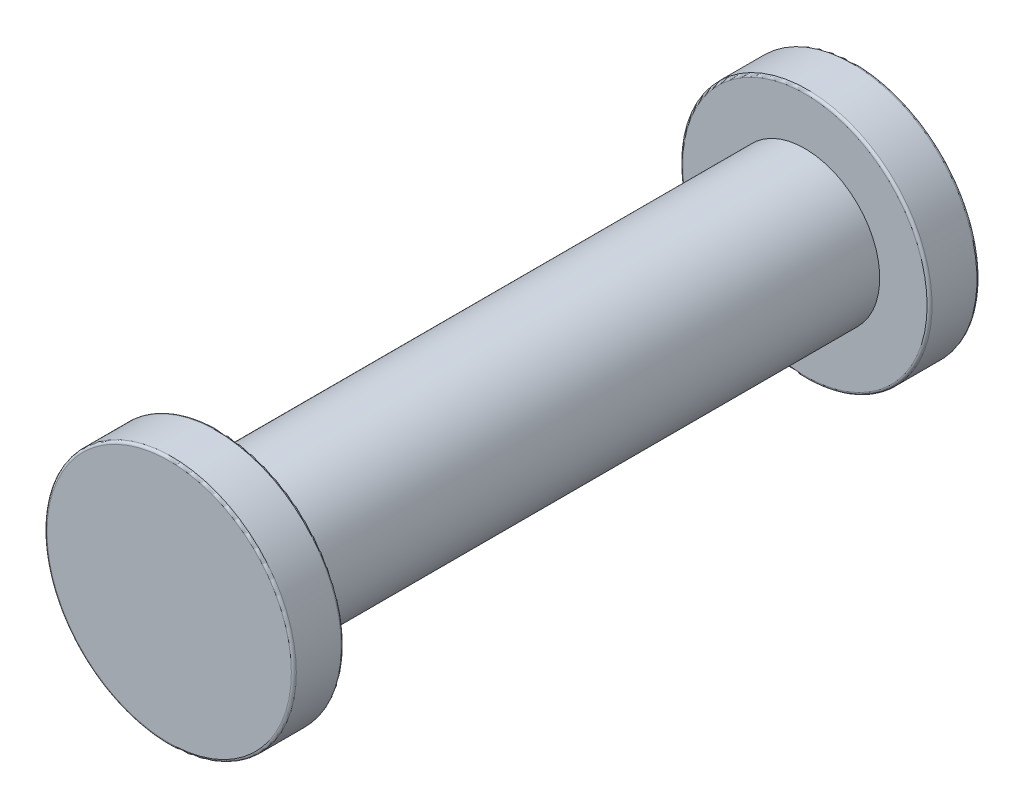
ISO-10303-21;
HEADER;
FILE_DESCRIPTION(('STEP AP214'),'2;1');
FILE_NAME('part.step','',(''),(''),'','','');
FILE_SCHEMA(('AUTOMOTIVE_DESIGN { 1 0 10303 214 1 1 1 1 }'));
ENDSEC;
DATA;
#1=APPLICATION_CONTEXT('core data for automotive mechanical design processes');
#2=APPLICATION_PROTOCOL_DEFINITION('international standard','automotive_design',2000,#1);
#3=PRODUCT_CONTEXT('',#1,'mechanical');
#4=PRODUCT('Part','Part','',(#3));
#5=PRODUCT_RELATED_PRODUCT_CATEGORY('part','',(#4));
#6=PRODUCT_DEFINITION_FORMATION('','',#4);
#7=PRODUCT_DEFINITION_CONTEXT('part definition',#1,'design');
#8=PRODUCT_DEFINITION('design','',#6,#7);
#9=PRODUCT_DEFINITION_SHAPE('','',#8);
#10=(LENGTH_UNIT() NAMED_UNIT(*) SI_UNIT(.MILLI.,.METRE.));
#11=(NAMED_UNIT(*) PLANE_ANGLE_UNIT() SI_UNIT($,.RADIAN.));
#12=(NAMED_UNIT(*) SI_UNIT($,.STERADIAN.) SOLID_ANGLE_UNIT());
#13=UNCERTAINTY_MEASURE_WITH_UNIT(LENGTH_MEASURE(1.E-05),#10,'distance_accuracy_value','');
#14=(GEOMETRIC_REPRESENTATION_CONTEXT(3) GLOBAL_UNCERTAINTY_ASSIGNED_CONTEXT((#13)) GLOBAL_UNIT_ASSIGNED_CONTEXT((#10,
#11,#12)) REPRESENTATION_CONTEXT('',''));
#15=CARTESIAN_POINT('',(0.,0.,0.));
#16=DIRECTION('',(0.,0.,1.));
#17=DIRECTION('',(1.,0.,0.));
#18=AXIS2_PLACEMENT_3D('',#15,#16,#17);
#19=CARTESIAN_POINT('',(0.,0.,4.2875));
#20=DIRECTION('',(0.,0.,1.));
#21=DIRECTION('',(1.,0.,0.));
#22=AXIS2_PLACEMENT_3D('',#19,#20,#21);
#23=CYLINDRICAL_SURFACE('',#22,4.75);
#24=CARTESIAN_POINT('',(0.,0.,4.3825));
#25=DIRECTION('',(0.,0.,1.));
#26=DIRECTION('',(1.,0.,0.));
#27=AXIS2_PLACEMENT_3D('',#24,#25,#26);
#28=CIRCLE('',#27,4.75);
#29=CARTESIAN_POINT('',(4.75,0.,4.3825));
#30=VERTEX_POINT('',#29);
#31=EDGE_CURVE('E58',#30,#30,#28,.T.);
#32=ORIENTED_EDGE('',*,*,#31,.T.);
#33=EDGE_LOOP('',(#32));
#34=FACE_BOUND('',#33,.T.);
#35=CARTESIAN_POINT('',(0.,0.,6.0925));
#36=DIRECTION('',(0.,0.,1.));
#37=DIRECTION('',(1.,0.,0.));
#38=AXIS2_PLACEMENT_3D('',#35,#36,#37);
#39=CIRCLE('',#38,4.75);
#40=CARTESIAN_POINT('',(4.75,0.,6.0925));
#41=VERTEX_POINT('',#40);
#42=EDGE_CURVE('E61',#41,#41,#39,.F.);
#43=ORIENTED_EDGE('',*,*,#42,.T.);
#44=EDGE_LOOP('',(#43));
#45=FACE_BOUND('',#44,.T.);
#46=ADVANCED_FACE('F32',(#34,#45),#23,.T.);
#47=CARTESIAN_POINT('',(0.,0.,4.2875));
#48=DIRECTION('',(0.,0.,1.));
#49=DIRECTION('',(1.,0.,0.));
#50=AXIS2_PLACEMENT_3D('',#47,#48,#49);
#51=PLANE('',#50);
#52=CARTESIAN_POINT('',(0.,0.,4.2875));
#53=DIRECTION('',(0.,0.,1.));
#54=DIRECTION('',(1.,0.,0.));
#55=AXIS2_PLACEMENT_3D('',#52,#53,#54);
#56=CIRCLE('',#55,4.655);
#57=CARTESIAN_POINT('',(4.655,0.,4.2875));
#58=VERTEX_POINT('',#57);
#59=EDGE_CURVE('E55',#58,#58,#56,.F.);
#60=ORIENTED_EDGE('',*,*,#59,.T.);
#61=EDGE_LOOP('',(#60));
#62=FACE_BOUND('',#61,.T.);
#63=CARTESIAN_POINT('',(0.,0.,4.2875));
#64=DIRECTION('',(0.,0.,-1.));
#65=DIRECTION('',(-1.,0.,0.));
#66=AXIS2_PLACEMENT_3D('',#63,#64,#65);
#67=CIRCLE('',#66,2.85);
#68=CARTESIAN_POINT('',(-2.85,0.,4.2875));
#69=VERTEX_POINT('',#68);
#70=EDGE_CURVE('E64',#69,#69,#67,.T.);
#71=ORIENTED_EDGE('',*,*,#70,.F.);
#72=EDGE_LOOP('',(#71));
#73=FACE_BOUND('',#72,.T.);
#74=ADVANCED_FACE('F81',(#62,#73),#51,.F.);
#75=CARTESIAN_POINT('',(0.,0.,6.1875));
#76=DIRECTION('',(0.,0.,1.));
#77=DIRECTION('',(1.,0.,0.));
#78=AXIS2_PLACEMENT_3D('',#75,#76,#77);
#79=PLANE('',#78);
#80=CARTESIAN_POINT('',(0.,0.,6.1875));
#81=DIRECTION('',(0.,0.,1.));
#82=DIRECTION('',(1.,0.,0.));
#83=AXIS2_PLACEMENT_3D('',#80,#81,#82);
#84=CIRCLE('',#83,4.655);
#85=CARTESIAN_POINT('',(4.655,0.,6.1875));
#86=VERTEX_POINT('',#85);
#87=EDGE_CURVE('E39',#86,#86,#84,.T.);
#88=ORIENTED_EDGE('',*,*,#87,.T.);
#89=EDGE_LOOP('',(#88));
#90=FACE_BOUND('',#89,.T.);
#91=ADVANCED_FACE('F77',(#90),#79,.T.);
#92=CARTESIAN_POINT('',(0.,0.,-18.0375));
#93=DIRECTION('',(0.,0.,1.));
#94=DIRECTION('',(1.,0.,0.));
#95=AXIS2_PLACEMENT_3D('',#92,#93,#94);
#96=CYLINDRICAL_SURFACE('',#95,2.85);
#97=CARTESIAN_POINT('',(0.,0.,-18.0375));
#98=DIRECTION('',(0.,0.,-1.));
#99=DIRECTION('',(-1.,0.,0.));
#100=AXIS2_PLACEMENT_3D('',#97,#98,#99);
#101=CIRCLE('',#100,2.85);
#102=CARTESIAN_POINT('',(-2.85,0.,-18.0375));
#103=VERTEX_POINT('',#102);
#104=EDGE_CURVE('E67',#103,#103,#101,.T.);
#105=ORIENTED_EDGE('',*,*,#104,.F.);
#106=EDGE_LOOP('',(#105));
#107=FACE_BOUND('',#106,.T.);
#108=ORIENTED_EDGE('',*,*,#70,.T.);
#109=EDGE_LOOP('',(#108));
#110=FACE_BOUND('',#109,.T.);
#111=ADVANCED_FACE('F73',(#107,#110),#96,.T.);
#112=CARTESIAN_POINT('',(0.,0.,-19.9375));
#113=DIRECTION('',(0.,0.,1.));
#114=DIRECTION('',(1.,0.,0.));
#115=AXIS2_PLACEMENT_3D('',#112,#113,#114);
#116=CYLINDRICAL_SURFACE('',#115,4.75);
#117=CARTESIAN_POINT('',(0.,0.,-18.1325));
#118=DIRECTION('',(0.,0.,-1.));
#119=DIRECTION('',(-1.,0.,0.));
#120=AXIS2_PLACEMENT_3D('',#117,#118,#119);
#121=CIRCLE('',#120,4.75);
#122=CARTESIAN_POINT('',(-4.75,0.,-18.1325));
#123=VERTEX_POINT('',#122);
#124=EDGE_CURVE('E47',#123,#123,#121,.T.);
#125=ORIENTED_EDGE('',*,*,#124,.T.);
#126=EDGE_LOOP('',(#125));
#127=FACE_BOUND('',#126,.T.);
#128=CARTESIAN_POINT('',(0.,0.,-19.8425));
#129=DIRECTION('',(0.,0.,-1.));
#130=DIRECTION('',(-1.,0.,0.));
#131=AXIS2_PLACEMENT_3D('',#128,#129,#130);
#132=CIRCLE('',#131,4.75);
#133=CARTESIAN_POINT('',(-4.75,0.,-19.8425));
#134=VERTEX_POINT('',#133);
#135=EDGE_CURVE('E52',#134,#134,#132,.F.);
#136=ORIENTED_EDGE('',*,*,#135,.T.);
#137=EDGE_LOOP('',(#136));
#138=FACE_BOUND('',#137,.T.);
#139=ADVANCED_FACE('F76',(#127,#138),#116,.T.);
#140=CARTESIAN_POINT('',(0.,0.,-19.9375));
#141=DIRECTION('',(0.,0.,-1.));
#142=DIRECTION('',(-1.,0.,0.));
#143=AXIS2_PLACEMENT_3D('',#140,#141,#142);
#144=PLANE('',#143);
#145=CARTESIAN_POINT('',(0.,0.,-19.9375));
#146=DIRECTION('',(0.,0.,-1.));
#147=DIRECTION('',(-1.,0.,0.));
#148=AXIS2_PLACEMENT_3D('',#145,#146,#147);
#149=CIRCLE('',#148,4.655);
#150=CARTESIAN_POINT('',(-4.655,0.,-19.9375));
#151=VERTEX_POINT('',#150);
#152=EDGE_CURVE('E10',#151,#151,#149,.T.);
#153=ORIENTED_EDGE('',*,*,#152,.T.);
#154=EDGE_LOOP('',(#153));
#155=FACE_BOUND('',#154,.T.);
#156=ADVANCED_FACE('F117',(#155),#144,.T.);
#157=CARTESIAN_POINT('',(0.,0.,-18.0375));
#158=DIRECTION('',(0.,0.,-1.));
#159=DIRECTION('',(-1.,0.,0.));
#160=AXIS2_PLACEMENT_3D('',#157,#158,#159);
#161=PLANE('',#160);
#162=CARTESIAN_POINT('',(0.,0.,-18.0375));
#163=DIRECTION('',(0.,0.,-1.));
#164=DIRECTION('',(-1.,0.,0.));
#165=AXIS2_PLACEMENT_3D('',#162,#163,#164);
#166=CIRCLE('',#165,4.655);
#167=CARTESIAN_POINT('',(-4.655,0.,-18.0375));
#168=VERTEX_POINT('',#167);
#169=EDGE_CURVE('E43',#168,#168,#166,.F.);
#170=ORIENTED_EDGE('',*,*,#169,.T.);
#171=EDGE_LOOP('',(#170));
#172=FACE_BOUND('',#171,.T.);
#173=ORIENTED_EDGE('',*,*,#104,.T.);
#174=EDGE_LOOP('',(#173));
#175=FACE_BOUND('',#174,.T.);
#176=ADVANCED_FACE('F71',(#172,#175),#161,.F.);
#177=CARTESIAN_POINT('',(0.,0.,4.3825));
#178=DIRECTION('',(0.,0.,1.));
#179=DIRECTION('',(1.,0.,0.));
#180=AXIS2_PLACEMENT_3D('',#177,#178,#179);
#181=TOROIDAL_SURFACE('',#180,4.655,0.095);
#182=ORIENTED_EDGE('',*,*,#59,.F.);
#183=EDGE_LOOP('',(#182));
#184=FACE_BOUND('',#183,.T.);
#185=ORIENTED_EDGE('',*,*,#31,.F.);
#186=EDGE_LOOP('',(#185));
#187=FACE_BOUND('',#186,.T.);
#188=ADVANCED_FACE('F94',(#184,#187),#181,.T.);
#189=CARTESIAN_POINT('',(0.,0.,-18.1325));
#190=DIRECTION('',(0.,0.,-1.));
#191=DIRECTION('',(-1.,0.,0.));
#192=AXIS2_PLACEMENT_3D('',#189,#190,#191);
#193=TOROIDAL_SURFACE('',#192,4.655,0.095);
#194=ORIENTED_EDGE('',*,*,#169,.F.);
#195=EDGE_LOOP('',(#194));
#196=FACE_BOUND('',#195,.T.);
#197=ORIENTED_EDGE('',*,*,#124,.F.);
#198=EDGE_LOOP('',(#197));
#199=FACE_BOUND('',#198,.T.);
#200=ADVANCED_FACE('F97',(#196,#199),#193,.T.);
#201=CARTESIAN_POINT('',(0.,0.,6.0925));
#202=DIRECTION('',(0.,0.,1.));
#203=DIRECTION('',(1.,0.,0.));
#204=AXIS2_PLACEMENT_3D('',#201,#202,#203);
#205=TOROIDAL_SURFACE('',#204,4.655,0.095);
#206=ORIENTED_EDGE('',*,*,#42,.F.);
#207=EDGE_LOOP('',(#206));
#208=FACE_BOUND('',#207,.T.);
#209=ORIENTED_EDGE('',*,*,#87,.F.);
#210=EDGE_LOOP('',(#209));
#211=FACE_BOUND('',#210,.T.);
#212=ADVANCED_FACE('F100',(#208,#211),#205,.T.);
#213=CARTESIAN_POINT('',(0.,0.,-19.8425));
#214=DIRECTION('',(0.,0.,-1.));
#215=DIRECTION('',(-1.,0.,0.));
#216=AXIS2_PLACEMENT_3D('',#213,#214,#215);
#217=TOROIDAL_SURFACE('',#216,4.655,0.095);
#218=ORIENTED_EDGE('',*,*,#135,.F.);
#219=EDGE_LOOP('',(#218));
#220=FACE_BOUND('',#219,.T.);
#221=ORIENTED_EDGE('',*,*,#152,.F.);
#222=EDGE_LOOP('',(#221));
#223=FACE_BOUND('',#222,.T.);
#224=ADVANCED_FACE('F34',(#220,#223),#217,.T.);
#225=CLOSED_SHELL('',(#46,#74,#91,#111,#139,#156,#176,#188,#200,#212,#224));
#226=MANIFOLD_SOLID_BREP('B2',#225);
#227=ADVANCED_BREP_SHAPE_REPRESENTATION('',(#18,#226),#14);
#228=SHAPE_DEFINITION_REPRESENTATION(#9,#227);
ENDSEC;
END-ISO-10303-21;
